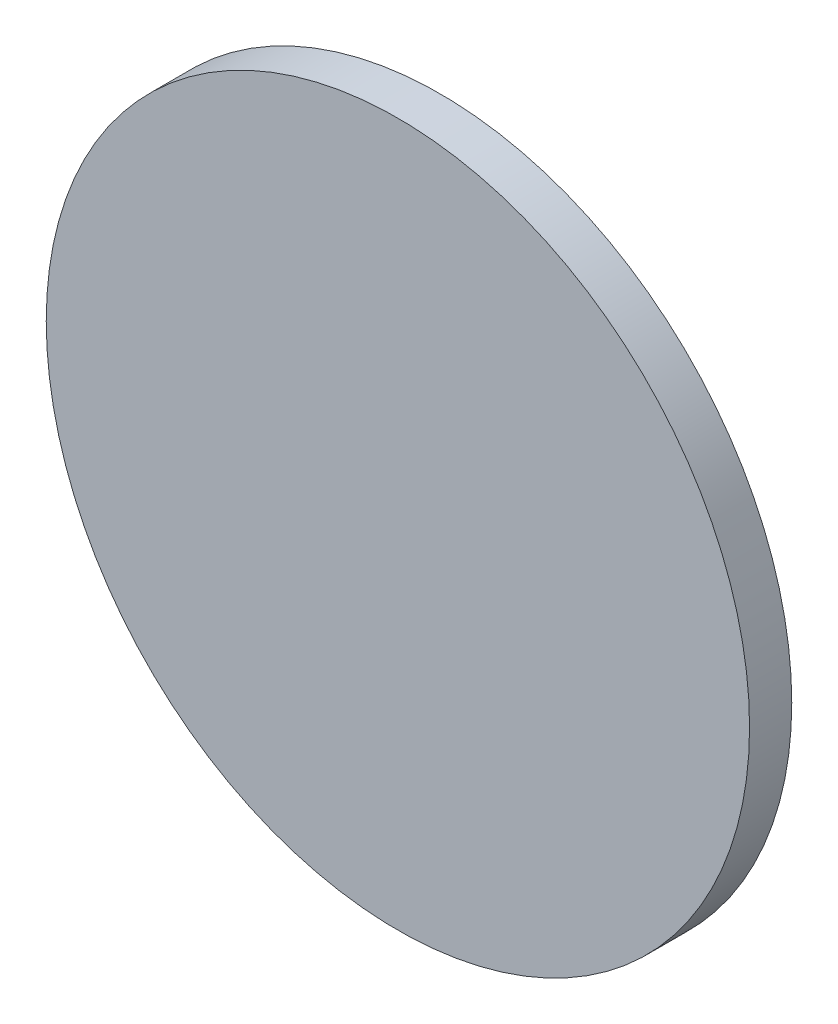
ISO-10303-21;
HEADER;
FILE_DESCRIPTION(('STEP AP214'),'2;1');
FILE_NAME('part.step','',(''),(''),'','','');
FILE_SCHEMA(('AUTOMOTIVE_DESIGN { 1 0 10303 214 1 1 1 1 }'));
ENDSEC;
DATA;
#1=APPLICATION_CONTEXT('core data for automotive mechanical design processes');
#2=APPLICATION_PROTOCOL_DEFINITION('international standard','automotive_design',2000,#1);
#3=PRODUCT_CONTEXT('',#1,'mechanical');
#4=PRODUCT('Part','Part','',(#3));
#5=PRODUCT_RELATED_PRODUCT_CATEGORY('part','',(#4));
#6=PRODUCT_DEFINITION_FORMATION('','',#4);
#7=PRODUCT_DEFINITION_CONTEXT('part definition',#1,'design');
#8=PRODUCT_DEFINITION('design','',#6,#7);
#9=PRODUCT_DEFINITION_SHAPE('','',#8);
#10=(LENGTH_UNIT() NAMED_UNIT(*) SI_UNIT(.MILLI.,.METRE.));
#11=(NAMED_UNIT(*) PLANE_ANGLE_UNIT() SI_UNIT($,.RADIAN.));
#12=(NAMED_UNIT(*) SI_UNIT($,.STERADIAN.) SOLID_ANGLE_UNIT());
#13=UNCERTAINTY_MEASURE_WITH_UNIT(LENGTH_MEASURE(1.E-05),#10,'distance_accuracy_value','');
#14=(GEOMETRIC_REPRESENTATION_CONTEXT(3) GLOBAL_UNCERTAINTY_ASSIGNED_CONTEXT((#13)) GLOBAL_UNIT_ASSIGNED_CONTEXT((#10,
#11,#12)) REPRESENTATION_CONTEXT('',''));
#15=CARTESIAN_POINT('',(0.,0.,0.));
#16=DIRECTION('',(0.,0.,1.));
#17=DIRECTION('',(1.,0.,0.));
#18=AXIS2_PLACEMENT_3D('',#15,#16,#17);
#19=CARTESIAN_POINT('',(0.,0.,15.));
#20=DIRECTION('',(0.,0.,-1.));
#21=DIRECTION('',(-1.,0.,0.));
#22=AXIS2_PLACEMENT_3D('',#19,#20,#21);
#23=CYLINDRICAL_SURFACE('',#22,125.);
#24=CARTESIAN_POINT('',(0.,0.,15.));
#25=DIRECTION('',(0.,0.,1.));
#26=DIRECTION('',(1.,0.,0.));
#27=AXIS2_PLACEMENT_3D('',#24,#25,#26);
#28=CIRCLE('',#27,125.);
#29=CARTESIAN_POINT('',(125.,0.,15.));
#30=VERTEX_POINT('',#29);
#31=EDGE_CURVE('E10',#30,#30,#28,.T.);
#32=ORIENTED_EDGE('',*,*,#31,.F.);
#33=EDGE_LOOP('',(#32));
#34=FACE_BOUND('',#33,.T.);
#35=CARTESIAN_POINT('',(0.,0.,0.));
#36=DIRECTION('',(0.,0.,1.));
#37=DIRECTION('',(1.,0.,0.));
#38=AXIS2_PLACEMENT_3D('',#35,#36,#37);
#39=CIRCLE('',#38,125.);
#40=CARTESIAN_POINT('',(125.,0.,0.));
#41=VERTEX_POINT('',#40);
#42=EDGE_CURVE('E37',#41,#41,#39,.T.);
#43=ORIENTED_EDGE('',*,*,#42,.T.);
#44=EDGE_LOOP('',(#43));
#45=FACE_BOUND('',#44,.T.);
#46=ADVANCED_FACE('F40',(#34,#45),#23,.T.);
#47=CARTESIAN_POINT('',(0.,0.,15.));
#48=DIRECTION('',(0.,0.,1.));
#49=DIRECTION('',(1.,0.,0.));
#50=AXIS2_PLACEMENT_3D('',#47,#48,#49);
#51=PLANE('',#50);
#52=ORIENTED_EDGE('',*,*,#31,.T.);
#53=EDGE_LOOP('',(#52));
#54=FACE_BOUND('',#53,.T.);
#55=ADVANCED_FACE('F55',(#54),#51,.T.);
#56=CARTESIAN_POINT('',(0.,0.,0.));
#57=DIRECTION('',(0.,0.,1.));
#58=DIRECTION('',(1.,0.,0.));
#59=AXIS2_PLACEMENT_3D('',#56,#57,#58);
#60=PLANE('',#59);
#61=ORIENTED_EDGE('',*,*,#42,.F.);
#62=EDGE_LOOP('',(#61));
#63=FACE_BOUND('',#62,.T.);
#64=ADVANCED_FACE('F49',(#63),#60,.F.);
#65=CLOSED_SHELL('',(#46,#55,#64));
#66=MANIFOLD_SOLID_BREP('B2',#65);
#67=ADVANCED_BREP_SHAPE_REPRESENTATION('',(#18,#66),#14);
#68=SHAPE_DEFINITION_REPRESENTATION(#9,#67);
ENDSEC;
END-ISO-10303-21;
